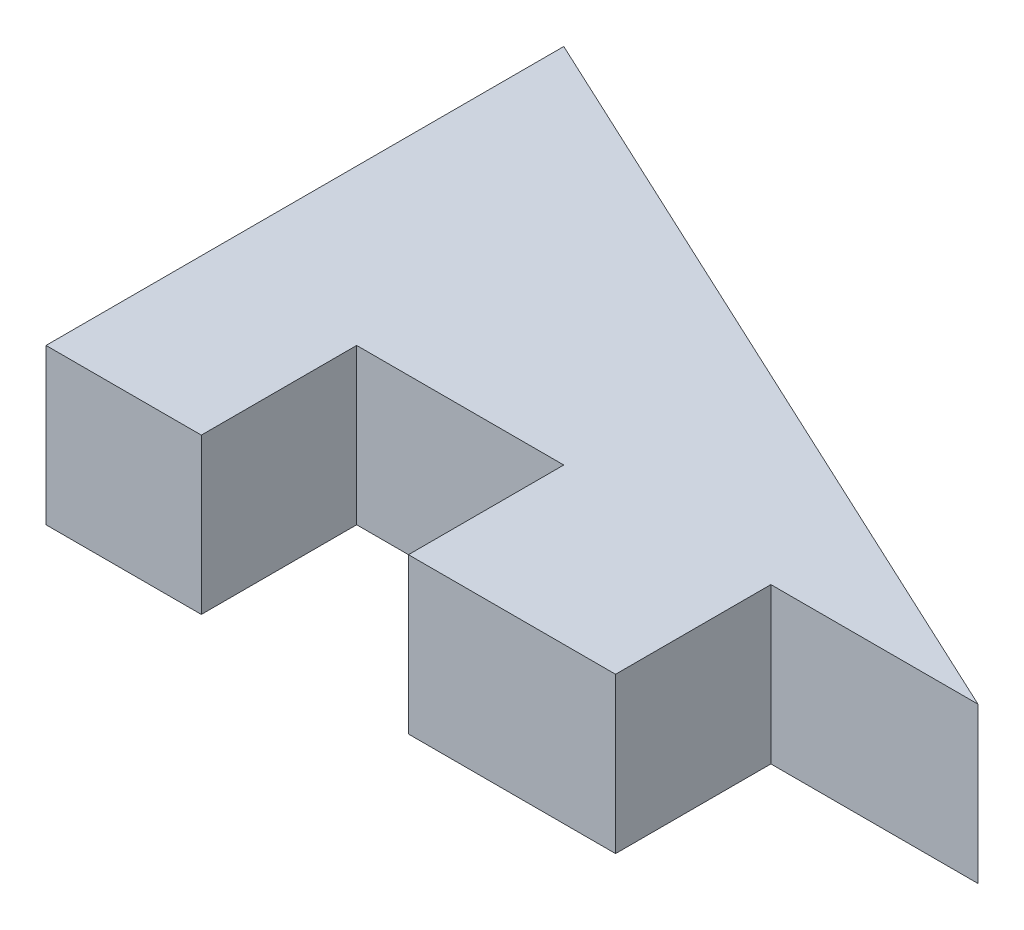
ISO-10303-21;
HEADER;
FILE_DESCRIPTION(('STEP AP214'),'2;1');
FILE_NAME('part.step','',(''),(''),'','','');
FILE_SCHEMA(('AUTOMOTIVE_DESIGN { 1 0 10303 214 1 1 1 1 }'));
ENDSEC;
DATA;
#1=APPLICATION_CONTEXT('core data for automotive mechanical design processes');
#2=APPLICATION_PROTOCOL_DEFINITION('international standard','automotive_design',2000,#1);
#3=PRODUCT_CONTEXT('',#1,'mechanical');
#4=PRODUCT('Part','Part','',(#3));
#5=PRODUCT_RELATED_PRODUCT_CATEGORY('part','',(#4));
#6=PRODUCT_DEFINITION_FORMATION('','',#4);
#7=PRODUCT_DEFINITION_CONTEXT('part definition',#1,'design');
#8=PRODUCT_DEFINITION('design','',#6,#7);
#9=PRODUCT_DEFINITION_SHAPE('','',#8);
#10=(LENGTH_UNIT() NAMED_UNIT(*) SI_UNIT(.MILLI.,.METRE.));
#11=(NAMED_UNIT(*) PLANE_ANGLE_UNIT() SI_UNIT($,.RADIAN.));
#12=(NAMED_UNIT(*) SI_UNIT($,.STERADIAN.) SOLID_ANGLE_UNIT());
#13=UNCERTAINTY_MEASURE_WITH_UNIT(LENGTH_MEASURE(1.E-05),#10,'distance_accuracy_value','');
#14=(GEOMETRIC_REPRESENTATION_CONTEXT(3) GLOBAL_UNCERTAINTY_ASSIGNED_CONTEXT((#13)) GLOBAL_UNIT_ASSIGNED_CONTEXT((#10,
#11,#12)) REPRESENTATION_CONTEXT('',''));
#15=CARTESIAN_POINT('',(0.,0.,0.));
#16=DIRECTION('',(0.,0.,1.));
#17=DIRECTION('',(1.,0.,0.));
#18=AXIS2_PLACEMENT_3D('',#15,#16,#17);
#19=CARTESIAN_POINT('',(-4.,3.,-3.));
#20=DIRECTION('',(0.,0.,-1.));
#21=DIRECTION('',(-1.,0.,0.));
#22=AXIS2_PLACEMENT_3D('',#19,#20,#21);
#23=PLANE('',#22);
#24=DIRECTION('',(1.,0.,0.));
#25=VECTOR('',#24,1.);
#26=CARTESIAN_POINT('',(-4.,0.,-3.));
#27=LINE('',#26,#25);
#28=CARTESIAN_POINT('',(-4.,0.,-3.));
#29=VERTEX_POINT('',#28);
#30=CARTESIAN_POINT('',(0.,0.,-3.));
#31=VERTEX_POINT('',#30);
#32=EDGE_CURVE('E135',#29,#31,#27,.T.);
#33=ORIENTED_EDGE('',*,*,#32,.T.);
#34=DIRECTION('',(0.,-1.,0.));
#35=VECTOR('',#34,1.);
#36=CARTESIAN_POINT('',(0.,3.,-3.));
#37=LINE('',#36,#35);
#38=CARTESIAN_POINT('',(0.,3.,-3.));
#39=VERTEX_POINT('',#38);
#40=EDGE_CURVE('E11',#39,#31,#37,.T.);
#41=ORIENTED_EDGE('',*,*,#40,.F.);
#42=DIRECTION('',(1.,0.,0.));
#43=VECTOR('',#42,1.);
#44=CARTESIAN_POINT('',(-4.,3.,-3.));
#45=LINE('',#44,#43);
#46=CARTESIAN_POINT('',(-4.,3.,-3.));
#47=VERTEX_POINT('',#46);
#48=EDGE_CURVE('E152',#47,#39,#45,.T.);
#49=ORIENTED_EDGE('',*,*,#48,.F.);
#50=DIRECTION('',(0.,-1.,0.));
#51=VECTOR('',#50,1.);
#52=CARTESIAN_POINT('',(-4.,3.,-3.));
#53=LINE('',#52,#51);
#54=EDGE_CURVE('E131',#47,#29,#53,.T.);
#55=ORIENTED_EDGE('',*,*,#54,.T.);
#56=EDGE_LOOP('',(#33,#41,#49,#55));
#57=FACE_BOUND('',#56,.T.);
#58=ADVANCED_FACE('F33',(#57),#23,.F.);
#59=CARTESIAN_POINT('',(-15.,3.,-10.));
#60=DIRECTION('',(-0.422885465331124,0.,0.906183139995265));
#61=DIRECTION('',(0.906183139995265,0.,0.422885465331124));
#62=AXIS2_PLACEMENT_3D('',#59,#60,#61);
#63=PLANE('',#62);
#64=DIRECTION('',(-0.906183139995265,0.,-0.422885465331124));
#65=VECTOR('',#64,1.);
#66=CARTESIAN_POINT('',(-15.,0.,-10.));
#67=LINE('',#66,#65);
#68=CARTESIAN_POINT('',(-15.,0.,-10.));
#69=VERTEX_POINT('',#68);
#70=EDGE_CURVE('E138',#31,#69,#67,.T.);
#71=ORIENTED_EDGE('',*,*,#70,.T.);
#72=DIRECTION('',(0.,-1.,0.));
#73=VECTOR('',#72,1.);
#74=CARTESIAN_POINT('',(-15.,3.,-10.));
#75=LINE('',#74,#73);
#76=CARTESIAN_POINT('',(-15.,3.,-10.));
#77=VERTEX_POINT('',#76);
#78=EDGE_CURVE('E41',#77,#69,#75,.T.);
#79=ORIENTED_EDGE('',*,*,#78,.F.);
#80=DIRECTION('',(-0.906183139995265,0.,-0.422885465331124));
#81=VECTOR('',#80,1.);
#82=CARTESIAN_POINT('',(-15.,3.,-10.));
#83=LINE('',#82,#81);
#84=EDGE_CURVE('E95',#39,#77,#83,.T.);
#85=ORIENTED_EDGE('',*,*,#84,.F.);
#86=ORIENTED_EDGE('',*,*,#40,.T.);
#87=EDGE_LOOP('',(#71,#79,#85,#86));
#88=FACE_BOUND('',#87,.T.);
#89=ADVANCED_FACE('F170',(#88),#63,.F.);
#90=CARTESIAN_POINT('',(-15.,3.,0.));
#91=DIRECTION('',(1.,0.,0.));
#92=DIRECTION('',(0.,0.,-1.));
#93=AXIS2_PLACEMENT_3D('',#90,#91,#92);
#94=PLANE('',#93);
#95=DIRECTION('',(0.,0.,1.));
#96=VECTOR('',#95,1.);
#97=CARTESIAN_POINT('',(-15.,0.,0.));
#98=LINE('',#97,#96);
#99=CARTESIAN_POINT('',(-15.,0.,0.));
#100=VERTEX_POINT('',#99);
#101=EDGE_CURVE('E141',#69,#100,#98,.T.);
#102=ORIENTED_EDGE('',*,*,#101,.T.);
#103=DIRECTION('',(0.,-1.,0.));
#104=VECTOR('',#103,1.);
#105=CARTESIAN_POINT('',(-15.,3.,0.));
#106=LINE('',#105,#104);
#107=CARTESIAN_POINT('',(-15.,3.,0.));
#108=VERTEX_POINT('',#107);
#109=EDGE_CURVE('E162',#108,#100,#106,.T.);
#110=ORIENTED_EDGE('',*,*,#109,.F.);
#111=DIRECTION('',(0.,0.,1.));
#112=VECTOR('',#111,1.);
#113=CARTESIAN_POINT('',(-15.,3.,-3.));
#114=LINE('',#113,#112);
#115=EDGE_CURVE('E169',#77,#108,#114,.T.);
#116=ORIENTED_EDGE('',*,*,#115,.F.);
#117=ORIENTED_EDGE('',*,*,#78,.T.);
#118=EDGE_LOOP('',(#102,#110,#116,#117));
#119=FACE_BOUND('',#118,.T.);
#120=ADVANCED_FACE('F167',(#119),#94,.F.);
#121=CARTESIAN_POINT('',(-12.,3.,0.));
#122=DIRECTION('',(0.,0.,-1.));
#123=DIRECTION('',(-1.,0.,0.));
#124=AXIS2_PLACEMENT_3D('',#121,#122,#123);
#125=PLANE('',#124);
#126=DIRECTION('',(1.,0.,0.));
#127=VECTOR('',#126,1.);
#128=CARTESIAN_POINT('',(-12.,0.,0.));
#129=LINE('',#128,#127);
#130=CARTESIAN_POINT('',(-12.,0.,0.));
#131=VERTEX_POINT('',#130);
#132=EDGE_CURVE('E143',#100,#131,#129,.T.);
#133=ORIENTED_EDGE('',*,*,#132,.T.);
#134=DIRECTION('',(0.,-1.,0.));
#135=VECTOR('',#134,1.);
#136=CARTESIAN_POINT('',(-12.,3.,0.));
#137=LINE('',#136,#135);
#138=CARTESIAN_POINT('',(-12.,3.,0.));
#139=VERTEX_POINT('',#138);
#140=EDGE_CURVE('E159',#139,#131,#137,.T.);
#141=ORIENTED_EDGE('',*,*,#140,.F.);
#142=DIRECTION('',(1.,0.,0.));
#143=VECTOR('',#142,1.);
#144=CARTESIAN_POINT('',(-12.,3.,0.));
#145=LINE('',#144,#143);
#146=EDGE_CURVE('E187',#108,#139,#145,.T.);
#147=ORIENTED_EDGE('',*,*,#146,.F.);
#148=ORIENTED_EDGE('',*,*,#109,.T.);
#149=EDGE_LOOP('',(#133,#141,#147,#148));
#150=FACE_BOUND('',#149,.T.);
#151=ADVANCED_FACE('F180',(#150),#125,.F.);
#152=CARTESIAN_POINT('',(-12.,3.,0.));
#153=DIRECTION('',(-1.,0.,0.));
#154=DIRECTION('',(0.,0.,1.));
#155=AXIS2_PLACEMENT_3D('',#152,#153,#154);
#156=PLANE('',#155);
#157=DIRECTION('',(0.,0.,-1.));
#158=VECTOR('',#157,1.);
#159=CARTESIAN_POINT('',(-12.,0.,0.));
#160=LINE('',#159,#158);
#161=CARTESIAN_POINT('',(-12.,0.,-3.));
#162=VERTEX_POINT('',#161);
#163=EDGE_CURVE('E145',#131,#162,#160,.T.);
#164=ORIENTED_EDGE('',*,*,#163,.T.);
#165=DIRECTION('',(0.,-1.,0.));
#166=VECTOR('',#165,1.);
#167=CARTESIAN_POINT('',(-12.,3.,-3.));
#168=LINE('',#167,#166);
#169=CARTESIAN_POINT('',(-12.,3.,-3.));
#170=VERTEX_POINT('',#169);
#171=EDGE_CURVE('E156',#170,#162,#168,.T.);
#172=ORIENTED_EDGE('',*,*,#171,.F.);
#173=DIRECTION('',(0.,0.,-1.));
#174=VECTOR('',#173,1.);
#175=CARTESIAN_POINT('',(-12.,3.,0.));
#176=LINE('',#175,#174);
#177=EDGE_CURVE('E186',#139,#170,#176,.T.);
#178=ORIENTED_EDGE('',*,*,#177,.F.);
#179=ORIENTED_EDGE('',*,*,#140,.T.);
#180=EDGE_LOOP('',(#164,#172,#178,#179));
#181=FACE_BOUND('',#180,.T.);
#182=ADVANCED_FACE('F184',(#181),#156,.F.);
#183=CARTESIAN_POINT('',(-12.,3.,-3.));
#184=DIRECTION('',(0.,0.,-1.));
#185=DIRECTION('',(-1.,0.,0.));
#186=AXIS2_PLACEMENT_3D('',#183,#184,#185);
#187=PLANE('',#186);
#188=DIRECTION('',(1.,0.,0.));
#189=VECTOR('',#188,1.);
#190=CARTESIAN_POINT('',(-12.,0.,-3.));
#191=LINE('',#190,#189);
#192=CARTESIAN_POINT('',(-8.,0.,-3.));
#193=VERTEX_POINT('',#192);
#194=EDGE_CURVE('E147',#162,#193,#191,.T.);
#195=ORIENTED_EDGE('',*,*,#194,.T.);
#196=DIRECTION('',(0.,-1.,0.));
#197=VECTOR('',#196,1.);
#198=CARTESIAN_POINT('',(-8.,3.,-3.));
#199=LINE('',#198,#197);
#200=CARTESIAN_POINT('',(-8.,3.,-3.));
#201=VERTEX_POINT('',#200);
#202=EDGE_CURVE('E126',#201,#193,#199,.T.);
#203=ORIENTED_EDGE('',*,*,#202,.F.);
#204=DIRECTION('',(1.,0.,0.));
#205=VECTOR('',#204,1.);
#206=CARTESIAN_POINT('',(-12.,3.,-3.));
#207=LINE('',#206,#205);
#208=EDGE_CURVE('E117',#170,#201,#207,.T.);
#209=ORIENTED_EDGE('',*,*,#208,.F.);
#210=ORIENTED_EDGE('',*,*,#171,.T.);
#211=EDGE_LOOP('',(#195,#203,#209,#210));
#212=FACE_BOUND('',#211,.T.);
#213=ADVANCED_FACE('F197',(#212),#187,.F.);
#214=CARTESIAN_POINT('',(-8.,3.,-3.));
#215=DIRECTION('',(1.,0.,0.));
#216=DIRECTION('',(0.,0.,-1.));
#217=AXIS2_PLACEMENT_3D('',#214,#215,#216);
#218=PLANE('',#217);
#219=DIRECTION('',(0.,0.,1.));
#220=VECTOR('',#219,1.);
#221=CARTESIAN_POINT('',(-8.,0.,-3.));
#222=LINE('',#221,#220);
#223=CARTESIAN_POINT('',(-8.,0.,0.));
#224=VERTEX_POINT('',#223);
#225=EDGE_CURVE('E125',#193,#224,#222,.T.);
#226=ORIENTED_EDGE('',*,*,#225,.T.);
#227=DIRECTION('',(0.,-1.,0.));
#228=VECTOR('',#227,1.);
#229=CARTESIAN_POINT('',(-8.,3.,0.));
#230=LINE('',#229,#228);
#231=CARTESIAN_POINT('',(-8.,3.,0.));
#232=VERTEX_POINT('',#231);
#233=EDGE_CURVE('E122',#232,#224,#230,.T.);
#234=ORIENTED_EDGE('',*,*,#233,.F.);
#235=DIRECTION('',(0.,0.,1.));
#236=VECTOR('',#235,1.);
#237=CARTESIAN_POINT('',(-8.,3.,-3.));
#238=LINE('',#237,#236);
#239=EDGE_CURVE('E111',#201,#232,#238,.T.);
#240=ORIENTED_EDGE('',*,*,#239,.F.);
#241=ORIENTED_EDGE('',*,*,#202,.T.);
#242=EDGE_LOOP('',(#226,#234,#240,#241));
#243=FACE_BOUND('',#242,.T.);
#244=ADVANCED_FACE('F123',(#243),#218,.F.);
#245=CARTESIAN_POINT('',(-8.,3.,0.));
#246=DIRECTION('',(0.,0.,-1.));
#247=DIRECTION('',(-1.,0.,0.));
#248=AXIS2_PLACEMENT_3D('',#245,#246,#247);
#249=PLANE('',#248);
#250=DIRECTION('',(1.,0.,0.));
#251=VECTOR('',#250,1.);
#252=CARTESIAN_POINT('',(-8.,0.,0.));
#253=LINE('',#252,#251);
#254=CARTESIAN_POINT('',(-4.,0.,0.));
#255=VERTEX_POINT('',#254);
#256=EDGE_CURVE('E81',#224,#255,#253,.T.);
#257=ORIENTED_EDGE('',*,*,#256,.T.);
#258=DIRECTION('',(0.,-1.,0.));
#259=VECTOR('',#258,1.);
#260=CARTESIAN_POINT('',(-4.,3.,0.));
#261=LINE('',#260,#259);
#262=CARTESIAN_POINT('',(-4.,3.,0.));
#263=VERTEX_POINT('',#262);
#264=EDGE_CURVE('E127',#263,#255,#261,.T.);
#265=ORIENTED_EDGE('',*,*,#264,.F.);
#266=DIRECTION('',(1.,0.,0.));
#267=VECTOR('',#266,1.);
#268=CARTESIAN_POINT('',(-8.,3.,0.));
#269=LINE('',#268,#267);
#270=EDGE_CURVE('E115',#232,#263,#269,.T.);
#271=ORIENTED_EDGE('',*,*,#270,.F.);
#272=ORIENTED_EDGE('',*,*,#233,.T.);
#273=EDGE_LOOP('',(#257,#265,#271,#272));
#274=FACE_BOUND('',#273,.T.);
#275=ADVANCED_FACE('F129',(#274),#249,.F.);
#276=CARTESIAN_POINT('',(-4.,3.,0.));
#277=DIRECTION('',(-1.,0.,0.));
#278=DIRECTION('',(0.,0.,1.));
#279=AXIS2_PLACEMENT_3D('',#276,#277,#278);
#280=PLANE('',#279);
#281=DIRECTION('',(0.,0.,-1.));
#282=VECTOR('',#281,1.);
#283=CARTESIAN_POINT('',(-4.,0.,0.));
#284=LINE('',#283,#282);
#285=EDGE_CURVE('E87',#255,#29,#284,.T.);
#286=ORIENTED_EDGE('',*,*,#285,.T.);
#287=ORIENTED_EDGE('',*,*,#54,.F.);
#288=DIRECTION('',(0.,0.,-1.));
#289=VECTOR('',#288,1.);
#290=CARTESIAN_POINT('',(-4.,3.,0.));
#291=LINE('',#290,#289);
#292=EDGE_CURVE('E49',#263,#47,#291,.T.);
#293=ORIENTED_EDGE('',*,*,#292,.F.);
#294=ORIENTED_EDGE('',*,*,#264,.T.);
#295=EDGE_LOOP('',(#286,#287,#293,#294));
#296=FACE_BOUND('',#295,.T.);
#297=ADVANCED_FACE('F195',(#296),#280,.F.);
#298=CARTESIAN_POINT('',(0.,3.,0.));
#299=DIRECTION('',(0.,1.,0.));
#300=DIRECTION('',(0.,0.,1.));
#301=AXIS2_PLACEMENT_3D('',#298,#299,#300);
#302=PLANE('',#301);
#303=ORIENTED_EDGE('',*,*,#48,.T.);
#304=ORIENTED_EDGE('',*,*,#84,.T.);
#305=ORIENTED_EDGE('',*,*,#115,.T.);
#306=ORIENTED_EDGE('',*,*,#146,.T.);
#307=ORIENTED_EDGE('',*,*,#177,.T.);
#308=ORIENTED_EDGE('',*,*,#208,.T.);
#309=ORIENTED_EDGE('',*,*,#239,.T.);
#310=ORIENTED_EDGE('',*,*,#270,.T.);
#311=ORIENTED_EDGE('',*,*,#292,.T.);
#312=EDGE_LOOP('',(#303,#304,#305,#306,#307,#308,#309,#310,#311));
#313=FACE_BOUND('',#312,.T.);
#314=ADVANCED_FACE('F113',(#313),#302,.T.);
#315=CARTESIAN_POINT('',(0.,0.,0.));
#316=DIRECTION('',(0.,1.,0.));
#317=DIRECTION('',(0.,0.,1.));
#318=AXIS2_PLACEMENT_3D('',#315,#316,#317);
#319=PLANE('',#318);
#320=ORIENTED_EDGE('',*,*,#32,.F.);
#321=ORIENTED_EDGE('',*,*,#285,.F.);
#322=ORIENTED_EDGE('',*,*,#256,.F.);
#323=ORIENTED_EDGE('',*,*,#225,.F.);
#324=ORIENTED_EDGE('',*,*,#194,.F.);
#325=ORIENTED_EDGE('',*,*,#163,.F.);
#326=ORIENTED_EDGE('',*,*,#132,.F.);
#327=ORIENTED_EDGE('',*,*,#101,.F.);
#328=ORIENTED_EDGE('',*,*,#70,.F.);
#329=EDGE_LOOP('',(#320,#321,#322,#323,#324,#325,#326,#327,#328));
#330=FACE_BOUND('',#329,.T.);
#331=ADVANCED_FACE('F174',(#330),#319,.F.);
#332=CLOSED_SHELL('',(#58,#89,#120,#151,#182,#213,#244,#275,#297,#314,#331));
#333=MANIFOLD_SOLID_BREP('B2',#332);
#334=ADVANCED_BREP_SHAPE_REPRESENTATION('',(#18,#333),#14);
#335=SHAPE_DEFINITION_REPRESENTATION(#9,#334);
ENDSEC;
END-ISO-10303-21;
